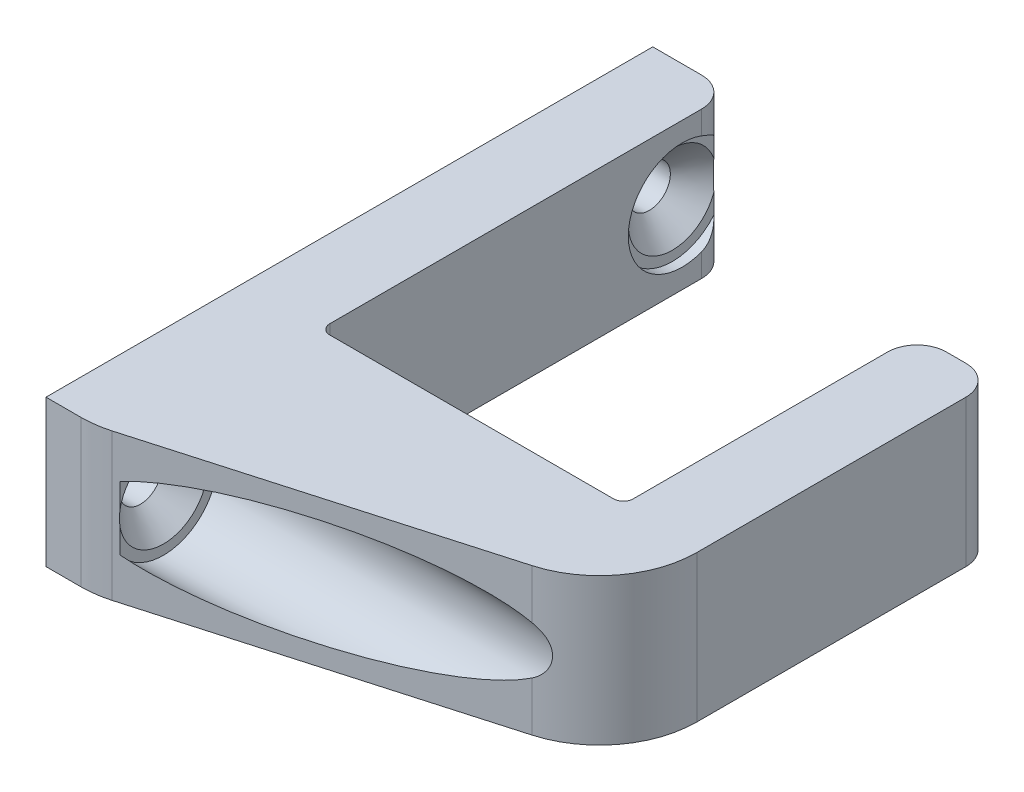
ISO-10303-21;
HEADER;
FILE_DESCRIPTION(('STEP AP214'),'2;1');
FILE_NAME('part.step','',(''),(''),'','','');
FILE_SCHEMA(('AUTOMOTIVE_DESIGN { 1 0 10303 214 1 1 1 1 }'));
ENDSEC;
DATA;
#1=APPLICATION_CONTEXT('core data for automotive mechanical design processes');
#2=APPLICATION_PROTOCOL_DEFINITION('international standard','automotive_design',2000,#1);
#3=PRODUCT_CONTEXT('',#1,'mechanical');
#4=PRODUCT('Part','Part','',(#3));
#5=PRODUCT_RELATED_PRODUCT_CATEGORY('part','',(#4));
#6=PRODUCT_DEFINITION_FORMATION('','',#4);
#7=PRODUCT_DEFINITION_CONTEXT('part definition',#1,'design');
#8=PRODUCT_DEFINITION('design','',#6,#7);
#9=PRODUCT_DEFINITION_SHAPE('','',#8);
#10=(LENGTH_UNIT() NAMED_UNIT(*) SI_UNIT(.MILLI.,.METRE.));
#11=(NAMED_UNIT(*) PLANE_ANGLE_UNIT() SI_UNIT($,.RADIAN.));
#12=(NAMED_UNIT(*) SI_UNIT($,.STERADIAN.) SOLID_ANGLE_UNIT());
#13=UNCERTAINTY_MEASURE_WITH_UNIT(LENGTH_MEASURE(1.E-05),#10,'distance_accuracy_value','');
#14=(GEOMETRIC_REPRESENTATION_CONTEXT(3) GLOBAL_UNCERTAINTY_ASSIGNED_CONTEXT((#13)) GLOBAL_UNIT_ASSIGNED_CONTEXT((#10,
#11,#12)) REPRESENTATION_CONTEXT('',''));
#15=CARTESIAN_POINT('',(0.,0.,0.));
#16=DIRECTION('',(0.,0.,1.));
#17=DIRECTION('',(1.,0.,0.));
#18=AXIS2_PLACEMENT_3D('',#15,#16,#17);
#19=CARTESIAN_POINT('',(31.,7.5,0.));
#20=DIRECTION('',(0.,0.,1.));
#21=DIRECTION('',(1.,0.,0.));
#22=AXIS2_PLACEMENT_3D('',#19,#20,#21);
#23=PLANE('',#22);
#24=DIRECTION('',(-1.,0.,0.));
#25=VECTOR('',#24,1.);
#26=CARTESIAN_POINT('',(31.,7.5,0.));
#27=LINE('',#26,#25);
#28=CARTESIAN_POINT('',(30.,7.5,0.));
#29=VERTEX_POINT('',#28);
#30=CARTESIAN_POINT('',(1.,7.5,0.));
#31=VERTEX_POINT('',#30);
#32=EDGE_CURVE('E388',#29,#31,#27,.T.);
#33=ORIENTED_EDGE('',*,*,#32,.F.);
#34=DIRECTION('',(0.,-1.,0.));
#35=VECTOR('',#34,1.);
#36=CARTESIAN_POINT('',(30.,-7.5,0.));
#37=LINE('',#36,#35);
#38=CARTESIAN_POINT('',(30.,-7.5,0.));
#39=VERTEX_POINT('',#38);
#40=EDGE_CURVE('E439',#29,#39,#37,.T.);
#41=ORIENTED_EDGE('',*,*,#40,.T.);
#42=DIRECTION('',(-1.,0.,0.));
#43=VECTOR('',#42,1.);
#44=CARTESIAN_POINT('',(31.,-7.5,0.));
#45=LINE('',#44,#43);
#46=CARTESIAN_POINT('',(1.,-7.5,0.));
#47=VERTEX_POINT('',#46);
#48=EDGE_CURVE('E412',#39,#47,#45,.T.);
#49=ORIENTED_EDGE('',*,*,#48,.T.);
#50=DIRECTION('',(0.,-1.,0.));
#51=VECTOR('',#50,1.);
#52=CARTESIAN_POINT('',(1.,7.5,0.));
#53=LINE('',#52,#51);
#54=EDGE_CURVE('E297',#47,#31,#53,.F.);
#55=ORIENTED_EDGE('',*,*,#54,.T.);
#56=EDGE_LOOP('',(#33,#41,#49,#55));
#57=FACE_BOUND('',#56,.T.);
#58=ADVANCED_FACE('F33',(#57),#23,.F.);
#59=CARTESIAN_POINT('',(0.,7.5,0.));
#60=DIRECTION('',(-1.,0.,0.));
#61=DIRECTION('',(0.,0.,1.));
#62=AXIS2_PLACEMENT_3D('',#59,#60,#61);
#63=PLANE('',#62);
#64=DIRECTION('',(0.,-1.,0.));
#65=VECTOR('',#64,1.);
#66=CARTESIAN_POINT('',(0.,7.5,-39.));
#67=LINE('',#66,#65);
#68=CARTESIAN_POINT('',(0.,-7.5,-39.));
#69=VERTEX_POINT('',#68);
#70=CARTESIAN_POINT('',(0.,-5.1234753829798,-39.));
#71=VERTEX_POINT('',#70);
#72=EDGE_CURVE('E245',#69,#71,#67,.F.);
#73=ORIENTED_EDGE('',*,*,#72,.T.);
#74=CARTESIAN_POINT('',(0.,0.,-37.));
#75=DIRECTION('',(-1.,0.,0.));
#76=DIRECTION('',(0.,0.,1.));
#77=AXIS2_PLACEMENT_3D('',#74,#75,#76);
#78=CIRCLE('',#77,5.5);
#79=CARTESIAN_POINT('',(0.,5.1234753829798,-39.));
#80=VERTEX_POINT('',#79);
#81=EDGE_CURVE('E362',#71,#80,#78,.T.);
#82=ORIENTED_EDGE('',*,*,#81,.T.);
#83=CARTESIAN_POINT('',(0.,7.5,-39.));
#84=VERTEX_POINT('',#83);
#85=EDGE_CURVE('E353',#80,#84,#67,.F.);
#86=ORIENTED_EDGE('',*,*,#85,.T.);
#87=DIRECTION('',(0.,0.,-1.));
#88=VECTOR('',#87,1.);
#89=CARTESIAN_POINT('',(0.,7.5,0.));
#90=LINE('',#89,#88);
#91=CARTESIAN_POINT('',(0.,7.5,-1.));
#92=VERTEX_POINT('',#91);
#93=EDGE_CURVE('E390',#92,#84,#90,.T.);
#94=ORIENTED_EDGE('',*,*,#93,.F.);
#95=DIRECTION('',(0.,-1.,0.));
#96=VECTOR('',#95,1.);
#97=CARTESIAN_POINT('',(0.,-7.5,-1.));
#98=LINE('',#97,#96);
#99=CARTESIAN_POINT('',(0.,-7.5,-1.));
#100=VERTEX_POINT('',#99);
#101=EDGE_CURVE('E299',#92,#100,#98,.T.);
#102=ORIENTED_EDGE('',*,*,#101,.T.);
#103=DIRECTION('',(0.,0.,-1.));
#104=VECTOR('',#103,1.);
#105=CARTESIAN_POINT('',(0.,-7.5,0.));
#106=LINE('',#105,#104);
#107=EDGE_CURVE('E364',#100,#69,#106,.T.);
#108=ORIENTED_EDGE('',*,*,#107,.T.);
#109=EDGE_LOOP('',(#73,#82,#86,#94,#102,#108));
#110=FACE_BOUND('',#109,.T.);
#111=ADVANCED_FACE('F270',(#110),#63,.F.);
#112=CARTESIAN_POINT('',(0.,7.5,-42.));
#113=DIRECTION('',(0.,0.,1.));
#114=DIRECTION('',(1.,0.,0.));
#115=AXIS2_PLACEMENT_3D('',#112,#113,#114);
#116=PLANE('',#115);
#117=DIRECTION('',(-1.,0.,0.));
#118=VECTOR('',#117,1.);
#119=CARTESIAN_POINT('',(0.,7.5,-42.));
#120=LINE('',#119,#118);
#121=CARTESIAN_POINT('',(-3.,7.5,-42.));
#122=VERTEX_POINT('',#121);
#123=CARTESIAN_POINT('',(-8.,7.5,-42.));
#124=VERTEX_POINT('',#123);
#125=EDGE_CURVE('E393',#122,#124,#120,.T.);
#126=ORIENTED_EDGE('',*,*,#125,.F.);
#127=DIRECTION('',(0.,-1.,0.));
#128=VECTOR('',#127,1.);
#129=CARTESIAN_POINT('',(-3.,7.5,-42.));
#130=LINE('',#129,#128);
#131=CARTESIAN_POINT('',(-3.,-7.5,-42.));
#132=VERTEX_POINT('',#131);
#133=EDGE_CURVE('E351',#122,#132,#130,.T.);
#134=ORIENTED_EDGE('',*,*,#133,.T.);
#135=DIRECTION('',(-1.,0.,0.));
#136=VECTOR('',#135,1.);
#137=CARTESIAN_POINT('',(0.,-7.5,-42.));
#138=LINE('',#137,#136);
#139=CARTESIAN_POINT('',(-8.,-7.5,-42.));
#140=VERTEX_POINT('',#139);
#141=EDGE_CURVE('E416',#132,#140,#138,.T.);
#142=ORIENTED_EDGE('',*,*,#141,.T.);
#143=DIRECTION('',(0.,-1.,0.));
#144=VECTOR('',#143,1.);
#145=CARTESIAN_POINT('',(-8.,7.5,-42.));
#146=LINE('',#145,#144);
#147=EDGE_CURVE('E435',#124,#140,#146,.T.);
#148=ORIENTED_EDGE('',*,*,#147,.F.);
#149=EDGE_LOOP('',(#126,#134,#142,#148));
#150=FACE_BOUND('',#149,.T.);
#151=ADVANCED_FACE('F276',(#150),#116,.F.);
#152=CARTESIAN_POINT('',(-8.,7.5,-42.));
#153=DIRECTION('',(1.,0.,0.));
#154=DIRECTION('',(0.,0.,-1.));
#155=AXIS2_PLACEMENT_3D('',#152,#153,#154);
#156=PLANE('',#155);
#157=CARTESIAN_POINT('',(-8.,0.,-37.));
#158=DIRECTION('',(1.,0.,0.));
#159=DIRECTION('',(0.,0.,-1.));
#160=AXIS2_PLACEMENT_3D('',#157,#158,#159);
#161=CIRCLE('',#160,2.15);
#162=CARTESIAN_POINT('',(-8.,0.,-39.15));
#163=VERTEX_POINT('',#162);
#164=EDGE_CURVE('E369',#163,#163,#161,.T.);
#165=ORIENTED_EDGE('',*,*,#164,.T.);
#166=EDGE_LOOP('',(#165));
#167=FACE_BOUND('',#166,.T.);
#168=CARTESIAN_POINT('',(-8.,0.,15.));
#169=DIRECTION('',(1.,0.,0.));
#170=DIRECTION('',(0.,0.,-1.));
#171=AXIS2_PLACEMENT_3D('',#168,#169,#170);
#172=CIRCLE('',#171,2.15);
#173=CARTESIAN_POINT('',(-8.,0.,12.85));
#174=VERTEX_POINT('',#173);
#175=EDGE_CURVE('E382',#174,#174,#172,.T.);
#176=ORIENTED_EDGE('',*,*,#175,.T.);
#177=EDGE_LOOP('',(#176));
#178=FACE_BOUND('',#177,.T.);
#179=DIRECTION('',(0.,0.,1.));
#180=VECTOR('',#179,1.);
#181=CARTESIAN_POINT('',(-8.,-7.5,-42.));
#182=LINE('',#181,#180);
#183=CARTESIAN_POINT('',(-7.99999999999999,-7.5,20.));
#184=VERTEX_POINT('',#183);
#185=EDGE_CURVE('E418',#140,#184,#182,.T.);
#186=ORIENTED_EDGE('',*,*,#185,.T.);
#187=DIRECTION('',(0.,-1.,0.));
#188=VECTOR('',#187,1.);
#189=CARTESIAN_POINT('',(-7.99999999999999,7.5,20.));
#190=LINE('',#189,#188);
#191=CARTESIAN_POINT('',(-7.99999999999999,7.5,20.));
#192=VERTEX_POINT('',#191);
#193=EDGE_CURVE('E411',#192,#184,#190,.T.);
#194=ORIENTED_EDGE('',*,*,#193,.F.);
#195=DIRECTION('',(0.,0.,1.));
#196=VECTOR('',#195,1.);
#197=CARTESIAN_POINT('',(-8.,7.5,-42.));
#198=LINE('',#197,#196);
#199=EDGE_CURVE('E395',#124,#192,#198,.T.);
#200=ORIENTED_EDGE('',*,*,#199,.F.);
#201=ORIENTED_EDGE('',*,*,#147,.T.);
#202=EDGE_LOOP('',(#186,#194,#200,#201));
#203=FACE_BOUND('',#202,.T.);
#204=ADVANCED_FACE('F463',(#167,#178,#203),#156,.F.);
#205=CARTESIAN_POINT('',(-7.99999999999999,7.5,20.));
#206=DIRECTION('',(0.,0.,-1.));
#207=DIRECTION('',(-1.,0.,0.));
#208=AXIS2_PLACEMENT_3D('',#205,#206,#207);
#209=PLANE('',#208);
#210=DIRECTION('',(1.,0.,0.));
#211=VECTOR('',#210,1.);
#212=CARTESIAN_POINT('',(-7.99999999999999,-7.5,20.));
#213=LINE('',#212,#211);
#214=CARTESIAN_POINT('',(-4.40054944640259,-7.5,20.));
#215=VERTEX_POINT('',#214);
#216=EDGE_CURVE('E420',#184,#215,#213,.T.);
#217=ORIENTED_EDGE('',*,*,#216,.T.);
#218=DIRECTION('',(0.,-1.,0.));
#219=VECTOR('',#218,1.);
#220=CARTESIAN_POINT('',(-4.40054944640259,7.5,20.));
#221=LINE('',#220,#219);
#222=CARTESIAN_POINT('',(-4.40054944640259,7.5,20.));
#223=VERTEX_POINT('',#222);
#224=EDGE_CURVE('E321',#215,#223,#221,.F.);
#225=ORIENTED_EDGE('',*,*,#224,.T.);
#226=DIRECTION('',(1.,0.,0.));
#227=VECTOR('',#226,1.);
#228=CARTESIAN_POINT('',(-7.99999999999999,7.5,20.));
#229=LINE('',#228,#227);
#230=EDGE_CURVE('E397',#192,#223,#229,.T.);
#231=ORIENTED_EDGE('',*,*,#230,.F.);
#232=ORIENTED_EDGE('',*,*,#193,.T.);
#233=EDGE_LOOP('',(#217,#225,#231,#232));
#234=FACE_BOUND('',#233,.T.);
#235=ADVANCED_FACE('F505',(#234),#209,.F.);
#236=CARTESIAN_POINT('',(-2.99999999999999,7.5,20.));
#237=DIRECTION('',(-0.274721127897378,0.,-0.961523947640823));
#238=DIRECTION('',(-0.961523947640823,0.,0.274721127897378));
#239=AXIS2_PLACEMENT_3D('',#236,#237,#238);
#240=PLANE('',#239);
#241=DIRECTION('',(0.,-1.,0.));
#242=VECTOR('',#241,1.);
#243=CARTESIAN_POINT('',(31.7472112789738,7.5,10.0722253488646));
#244=LINE('',#243,#242);
#245=CARTESIAN_POINT('',(31.7472112789738,-7.5,10.0722253488646));
#246=VERTEX_POINT('',#245);
#247=CARTESIAN_POINT('',(31.7472112789738,-2.44275192920356,10.0722253488646));
#248=VERTEX_POINT('',#247);
#249=EDGE_CURVE('E307',#246,#248,#244,.F.);
#250=ORIENTED_EDGE('',*,*,#249,.T.);
#251=CARTESIAN_POINT('',(14.5,0.,15.));
#252=DIRECTION('',(-0.274721127897378,0.,-0.961523947640823));
#253=DIRECTION('',(0.961523947640823,0.,-0.274721127897378));
#254=AXIS2_PLACEMENT_3D('',#251,#252,#253);
#255=ELLIPSE('',#254,20.0203021955214,5.5);
#256=CARTESIAN_POINT('',(-1.,-3.26155715909453,19.4285714285714));
#257=VERTEX_POINT('',#256);
#258=EDGE_CURVE('E60',#248,#257,#255,.T.);
#259=ORIENTED_EDGE('',*,*,#258,.T.);
#260=DIRECTION('',(0.,1.,0.));
#261=VECTOR('',#260,1.);
#262=CARTESIAN_POINT('',(-1.,7.5,19.4285714285714));
#263=LINE('',#262,#261);
#264=CARTESIAN_POINT('',(-1.,-0.798595706249905,19.4285714285714));
#265=VERTEX_POINT('',#264);
#266=EDGE_CURVE('E192',#257,#265,#263,.T.);
#267=ORIENTED_EDGE('',*,*,#266,.T.);
#268=CARTESIAN_POINT('',(-0.999799999999978,-0.800038287349248,19.4285142857143));
#269=CARTESIAN_POINT('',(-1.01827399540867,-0.667278613983204,19.4337925701168));
#270=CARTESIAN_POINT('',(-1.03223751921894,-0.533821122148111,19.4377821483483));
#271=CARTESIAN_POINT('',(-1.0508542556462,-0.266906677776435,19.4431012158989));
#272=CARTESIAN_POINT('',(-1.05555555555555,-0.133453338888257,19.4444444444444));
#273=CARTESIAN_POINT('',(-1.05555555555555,0.133453338888099,19.4444444444444));
#274=CARTESIAN_POINT('',(-1.05085425564621,0.266906677776278,19.4431012158989));
#275=CARTESIAN_POINT('',(-1.03223751921896,0.533821122147954,19.4377821483483));
#276=CARTESIAN_POINT('',(-1.01827399540868,0.667278613983047,19.4337925701168));
#277=CARTESIAN_POINT('',(-0.9998,0.800038287349092,19.4285142857143));
#278=B_SPLINE_CURVE_WITH_KNOTS('',3,(#268,#269,#270,#271,#272,#273,#274,#275,#276,#277),
.UNSPECIFIED.,.F.,.F.,(4,2,2,2,4),(0.,0.402374578373964,0.802654558989266,1.20293453960457,
1.60530911797853),.UNSPECIFIED.);
#279=CARTESIAN_POINT('',(-1.,0.798595706249905,19.4285714285714));
#280=VERTEX_POINT('',#279);
#281=EDGE_CURVE('E244',#265,#280,#278,.T.);
#282=ORIENTED_EDGE('',*,*,#281,.T.);
#283=CARTESIAN_POINT('',(-1.,3.26155715909453,19.4285714285714));
#284=VERTEX_POINT('',#283);
#285=EDGE_CURVE('E675',#280,#284,#263,.T.);
#286=ORIENTED_EDGE('',*,*,#285,.T.);
#287=CARTESIAN_POINT('',(31.7472112789738,2.44275192920357,10.0722253488646));
#288=VERTEX_POINT('',#287);
#289=EDGE_CURVE('E385',#284,#288,#255,.T.);
#290=ORIENTED_EDGE('',*,*,#289,.T.);
#291=CARTESIAN_POINT('',(31.7472112789738,7.5,10.0722253488646));
#292=VERTEX_POINT('',#291);
#293=EDGE_CURVE('E304',#288,#292,#244,.F.);
#294=ORIENTED_EDGE('',*,*,#293,.T.);
#295=DIRECTION('',(0.961523947640823,0.,-0.274721127897378));
#296=VECTOR('',#295,1.);
#297=CARTESIAN_POINT('',(-2.99999999999999,7.5,20.));
#298=LINE('',#297,#296);
#299=CARTESIAN_POINT('',(-1.6533381674288,7.5,19.6152394764082));
#300=VERTEX_POINT('',#299);
#301=EDGE_CURVE('E400',#300,#292,#298,.T.);
#302=ORIENTED_EDGE('',*,*,#301,.F.);
#303=DIRECTION('',(0.,-1.,0.));
#304=VECTOR('',#303,1.);
#305=CARTESIAN_POINT('',(-1.6533381674288,7.5,19.6152394764082));
#306=LINE('',#305,#304);
#307=CARTESIAN_POINT('',(-1.6533381674288,-7.5,19.6152394764082));
#308=VERTEX_POINT('',#307);
#309=EDGE_CURVE('E314',#300,#308,#306,.T.);
#310=ORIENTED_EDGE('',*,*,#309,.T.);
#311=DIRECTION('',(0.961523947640823,0.,-0.274721127897378));
#312=VECTOR('',#311,1.);
#313=CARTESIAN_POINT('',(-2.99999999999999,-7.5,20.));
#314=LINE('',#313,#312);
#315=EDGE_CURVE('E423',#308,#246,#314,.T.);
#316=ORIENTED_EDGE('',*,*,#315,.T.);
#317=EDGE_LOOP('',(#250,#259,#267,#282,#286,#290,#294,#302,#310,#316));
#318=FACE_BOUND('',#317,.T.);
#319=ADVANCED_FACE('F472',(#318),#240,.F.);
#320=CARTESIAN_POINT('',(39.,7.5,8.));
#321=DIRECTION('',(-1.,0.,0.));
#322=DIRECTION('',(0.,0.,1.));
#323=AXIS2_PLACEMENT_3D('',#320,#321,#322);
#324=PLANE('',#323);
#325=DIRECTION('',(0.,0.,-1.));
#326=VECTOR('',#325,1.);
#327=CARTESIAN_POINT('',(39.,-7.5,8.));
#328=LINE('',#327,#326);
#329=CARTESIAN_POINT('',(39.,-7.5,0.456985872456401));
#330=VERTEX_POINT('',#329);
#331=CARTESIAN_POINT('',(39.,-7.5,-27.));
#332=VERTEX_POINT('',#331);
#333=EDGE_CURVE('E426',#330,#332,#328,.T.);
#334=ORIENTED_EDGE('',*,*,#333,.T.);
#335=DIRECTION('',(0.,-1.,0.));
#336=VECTOR('',#335,1.);
#337=CARTESIAN_POINT('',(39.,7.5,-27.));
#338=LINE('',#337,#336);
#339=CARTESIAN_POINT('',(39.,7.5,-27.));
#340=VERTEX_POINT('',#339);
#341=EDGE_CURVE('E341',#332,#340,#338,.F.);
#342=ORIENTED_EDGE('',*,*,#341,.T.);
#343=DIRECTION('',(0.,0.,-1.));
#344=VECTOR('',#343,1.);
#345=CARTESIAN_POINT('',(39.,7.5,8.));
#346=LINE('',#345,#344);
#347=CARTESIAN_POINT('',(39.,7.5,0.456985872456401));
#348=VERTEX_POINT('',#347);
#349=EDGE_CURVE('E403',#348,#340,#346,.T.);
#350=ORIENTED_EDGE('',*,*,#349,.F.);
#351=DIRECTION('',(0.,-1.,0.));
#352=VECTOR('',#351,1.);
#353=CARTESIAN_POINT('',(39.,7.5,0.456985872456401));
#354=LINE('',#353,#352);
#355=EDGE_CURVE('E327',#348,#330,#354,.T.);
#356=ORIENTED_EDGE('',*,*,#355,.T.);
#357=EDGE_LOOP('',(#334,#342,#350,#356));
#358=FACE_BOUND('',#357,.T.);
#359=ADVANCED_FACE('F480',(#358),#324,.F.);
#360=CARTESIAN_POINT('',(39.,7.5,-30.));
#361=DIRECTION('',(0.,0.,1.));
#362=DIRECTION('',(1.,0.,0.));
#363=AXIS2_PLACEMENT_3D('',#360,#361,#362);
#364=PLANE('',#363);
#365=DIRECTION('',(-1.,0.,0.));
#366=VECTOR('',#365,1.);
#367=CARTESIAN_POINT('',(39.,7.5,-30.));
#368=LINE('',#367,#366);
#369=CARTESIAN_POINT('',(36.,7.5,-30.));
#370=VERTEX_POINT('',#369);
#371=CARTESIAN_POINT('',(34.,7.5,-30.));
#372=VERTEX_POINT('',#371);
#373=EDGE_CURVE('E406',#370,#372,#368,.T.);
#374=ORIENTED_EDGE('',*,*,#373,.F.);
#375=DIRECTION('',(0.,-1.,0.));
#376=VECTOR('',#375,1.);
#377=CARTESIAN_POINT('',(36.,7.5,-30.));
#378=LINE('',#377,#376);
#379=CARTESIAN_POINT('',(36.,-7.5,-30.));
#380=VERTEX_POINT('',#379);
#381=EDGE_CURVE('E332',#370,#380,#378,.T.);
#382=ORIENTED_EDGE('',*,*,#381,.T.);
#383=DIRECTION('',(-1.,0.,0.));
#384=VECTOR('',#383,1.);
#385=CARTESIAN_POINT('',(39.,-7.5,-30.));
#386=LINE('',#385,#384);
#387=CARTESIAN_POINT('',(34.,-7.5,-30.));
#388=VERTEX_POINT('',#387);
#389=EDGE_CURVE('E429',#380,#388,#386,.T.);
#390=ORIENTED_EDGE('',*,*,#389,.T.);
#391=DIRECTION('',(0.,-1.,0.));
#392=VECTOR('',#391,1.);
#393=CARTESIAN_POINT('',(34.,7.5,-30.));
#394=LINE('',#393,#392);
#395=EDGE_CURVE('E330',#388,#372,#394,.F.);
#396=ORIENTED_EDGE('',*,*,#395,.T.);
#397=EDGE_LOOP('',(#374,#382,#390,#396));
#398=FACE_BOUND('',#397,.T.);
#399=ADVANCED_FACE('F486',(#398),#364,.F.);
#400=CARTESIAN_POINT('',(31.,7.5,-30.));
#401=DIRECTION('',(1.,0.,0.));
#402=DIRECTION('',(0.,0.,-1.));
#403=AXIS2_PLACEMENT_3D('',#400,#401,#402);
#404=PLANE('',#403);
#405=DIRECTION('',(0.,0.,1.));
#406=VECTOR('',#405,1.);
#407=CARTESIAN_POINT('',(31.,7.5,-30.));
#408=LINE('',#407,#406);
#409=CARTESIAN_POINT('',(31.,7.5,-27.));
#410=VERTEX_POINT('',#409);
#411=CARTESIAN_POINT('',(31.,7.5,-1.));
#412=VERTEX_POINT('',#411);
#413=EDGE_CURVE('E409',#410,#412,#408,.T.);
#414=ORIENTED_EDGE('',*,*,#413,.F.);
#415=DIRECTION('',(0.,-1.,0.));
#416=VECTOR('',#415,1.);
#417=CARTESIAN_POINT('',(31.,7.5,-27.));
#418=LINE('',#417,#416);
#419=CARTESIAN_POINT('',(31.,-7.5,-27.));
#420=VERTEX_POINT('',#419);
#421=EDGE_CURVE('E349',#410,#420,#418,.T.);
#422=ORIENTED_EDGE('',*,*,#421,.T.);
#423=DIRECTION('',(0.,0.,1.));
#424=VECTOR('',#423,1.);
#425=CARTESIAN_POINT('',(31.,-7.5,-30.));
#426=LINE('',#425,#424);
#427=CARTESIAN_POINT('',(31.,-7.5,-1.));
#428=VERTEX_POINT('',#427);
#429=EDGE_CURVE('E391',#420,#428,#426,.T.);
#430=ORIENTED_EDGE('',*,*,#429,.T.);
#431=DIRECTION('',(0.,-1.,0.));
#432=VECTOR('',#431,1.);
#433=CARTESIAN_POINT('',(31.,7.5,-1.));
#434=LINE('',#433,#432);
#435=EDGE_CURVE('E442',#428,#412,#434,.F.);
#436=ORIENTED_EDGE('',*,*,#435,.T.);
#437=EDGE_LOOP('',(#414,#422,#430,#436));
#438=FACE_BOUND('',#437,.T.);
#439=ADVANCED_FACE('F490',(#438),#404,.F.);
#440=CARTESIAN_POINT('',(0.,7.5,0.));
#441=DIRECTION('',(0.,-1.,0.));
#442=DIRECTION('',(0.,0.,-1.));
#443=AXIS2_PLACEMENT_3D('',#440,#441,#442);
#444=PLANE('',#443);
#445=ORIENTED_EDGE('',*,*,#349,.T.);
#446=CARTESIAN_POINT('',(36.,7.5,-27.));
#447=DIRECTION('',(0.,-1.,0.));
#448=DIRECTION('',(0.,0.,-1.));
#449=AXIS2_PLACEMENT_3D('',#446,#447,#448);
#450=CIRCLE('',#449,3.);
#451=EDGE_CURVE('E347',#340,#370,#450,.F.);
#452=ORIENTED_EDGE('',*,*,#451,.T.);
#453=ORIENTED_EDGE('',*,*,#373,.T.);
#454=CARTESIAN_POINT('',(34.,7.5,-27.));
#455=DIRECTION('',(0.,-1.,0.));
#456=DIRECTION('',(0.,0.,-1.));
#457=AXIS2_PLACEMENT_3D('',#454,#455,#456);
#458=CIRCLE('',#457,3.);
#459=EDGE_CURVE('E345',#372,#410,#458,.F.);
#460=ORIENTED_EDGE('',*,*,#459,.T.);
#461=ORIENTED_EDGE('',*,*,#413,.T.);
#462=CARTESIAN_POINT('',(30.,7.5,-1.));
#463=DIRECTION('',(0.,-1.,0.));
#464=DIRECTION('',(0.,0.,-1.));
#465=AXIS2_PLACEMENT_3D('',#462,#463,#464);
#466=CIRCLE('',#465,1.);
#467=EDGE_CURVE('E309',#412,#29,#466,.T.);
#468=ORIENTED_EDGE('',*,*,#467,.T.);
#469=ORIENTED_EDGE('',*,*,#32,.T.);
#470=CARTESIAN_POINT('',(1.,7.5,-1.));
#471=DIRECTION('',(0.,-1.,0.));
#472=DIRECTION('',(0.,0.,-1.));
#473=AXIS2_PLACEMENT_3D('',#470,#471,#472);
#474=CIRCLE('',#473,1.);
#475=EDGE_CURVE('E296',#31,#92,#474,.T.);
#476=ORIENTED_EDGE('',*,*,#475,.T.);
#477=ORIENTED_EDGE('',*,*,#93,.T.);
#478=CARTESIAN_POINT('',(-3.,7.5,-39.));
#479=DIRECTION('',(0.,-1.,0.));
#480=DIRECTION('',(0.,0.,-1.));
#481=AXIS2_PLACEMENT_3D('',#478,#479,#480);
#482=CIRCLE('',#481,3.);
#483=EDGE_CURVE('E343',#84,#122,#482,.F.);
#484=ORIENTED_EDGE('',*,*,#483,.T.);
#485=ORIENTED_EDGE('',*,*,#125,.T.);
#486=ORIENTED_EDGE('',*,*,#199,.T.);
#487=ORIENTED_EDGE('',*,*,#230,.T.);
#488=CARTESIAN_POINT('',(-4.40054944640259,7.5,10.));
#489=DIRECTION('',(0.,-1.,0.));
#490=DIRECTION('',(0.,0.,-1.));
#491=AXIS2_PLACEMENT_3D('',#488,#489,#490);
#492=CIRCLE('',#491,10.);
#493=EDGE_CURVE('E325',#223,#300,#492,.F.);
#494=ORIENTED_EDGE('',*,*,#493,.T.);
#495=ORIENTED_EDGE('',*,*,#301,.T.);
#496=CARTESIAN_POINT('',(29.,7.5,0.456985872456401));
#497=DIRECTION('',(0.,-1.,0.));
#498=DIRECTION('',(0.,0.,-1.));
#499=AXIS2_PLACEMENT_3D('',#496,#497,#498);
#500=CIRCLE('',#499,10.);
#501=EDGE_CURVE('E323',#292,#348,#500,.F.);
#502=ORIENTED_EDGE('',*,*,#501,.T.);
#503=EDGE_LOOP('',(#445,#452,#453,#460,#461,#468,#469,#476,#477,#484,#485,#486,#487,#494,#495,#502));
#504=FACE_BOUND('',#503,.T.);
#505=ADVANCED_FACE('F449',(#504),#444,.F.);
#506=CARTESIAN_POINT('',(0.,-7.5,0.));
#507=DIRECTION('',(0.,-1.,0.));
#508=DIRECTION('',(0.,0.,-1.));
#509=AXIS2_PLACEMENT_3D('',#506,#507,#508);
#510=PLANE('',#509);
#511=ORIENTED_EDGE('',*,*,#389,.F.);
#512=CARTESIAN_POINT('',(36.,-7.5,-27.));
#513=DIRECTION('',(0.,-1.,0.));
#514=DIRECTION('',(0.,0.,-1.));
#515=AXIS2_PLACEMENT_3D('',#512,#513,#514);
#516=CIRCLE('',#515,3.);
#517=EDGE_CURVE('E339',#380,#332,#516,.T.);
#518=ORIENTED_EDGE('',*,*,#517,.T.);
#519=ORIENTED_EDGE('',*,*,#333,.F.);
#520=CARTESIAN_POINT('',(29.,-7.5,0.456985872456401));
#521=DIRECTION('',(0.,-1.,0.));
#522=DIRECTION('',(0.,0.,-1.));
#523=AXIS2_PLACEMENT_3D('',#520,#521,#522);
#524=CIRCLE('',#523,10.);
#525=EDGE_CURVE('E317',#330,#246,#524,.T.);
#526=ORIENTED_EDGE('',*,*,#525,.T.);
#527=ORIENTED_EDGE('',*,*,#315,.F.);
#528=CARTESIAN_POINT('',(-4.40054944640259,-7.5,10.));
#529=DIRECTION('',(0.,-1.,0.));
#530=DIRECTION('',(0.,0.,-1.));
#531=AXIS2_PLACEMENT_3D('',#528,#529,#530);
#532=CIRCLE('',#531,10.);
#533=EDGE_CURVE('E319',#308,#215,#532,.T.);
#534=ORIENTED_EDGE('',*,*,#533,.T.);
#535=ORIENTED_EDGE('',*,*,#216,.F.);
#536=ORIENTED_EDGE('',*,*,#185,.F.);
#537=ORIENTED_EDGE('',*,*,#141,.F.);
#538=CARTESIAN_POINT('',(-3.,-7.5,-39.));
#539=DIRECTION('',(0.,-1.,0.));
#540=DIRECTION('',(0.,0.,-1.));
#541=AXIS2_PLACEMENT_3D('',#538,#539,#540);
#542=CIRCLE('',#541,3.);
#543=EDGE_CURVE('E335',#132,#69,#542,.T.);
#544=ORIENTED_EDGE('',*,*,#543,.T.);
#545=ORIENTED_EDGE('',*,*,#107,.F.);
#546=CARTESIAN_POINT('',(1.,-7.5,-1.));
#547=DIRECTION('',(0.,-1.,0.));
#548=DIRECTION('',(0.,0.,-1.));
#549=AXIS2_PLACEMENT_3D('',#546,#547,#548);
#550=CIRCLE('',#549,1.);
#551=EDGE_CURVE('E305',#100,#47,#550,.F.);
#552=ORIENTED_EDGE('',*,*,#551,.T.);
#553=ORIENTED_EDGE('',*,*,#48,.F.);
#554=CARTESIAN_POINT('',(30.,-7.5,-1.));
#555=DIRECTION('',(0.,-1.,0.));
#556=DIRECTION('',(0.,0.,-1.));
#557=AXIS2_PLACEMENT_3D('',#554,#555,#556);
#558=CIRCLE('',#557,1.);
#559=EDGE_CURVE('E446',#39,#428,#558,.F.);
#560=ORIENTED_EDGE('',*,*,#559,.T.);
#561=ORIENTED_EDGE('',*,*,#429,.F.);
#562=CARTESIAN_POINT('',(34.,-7.5,-27.));
#563=DIRECTION('',(0.,-1.,0.));
#564=DIRECTION('',(0.,0.,-1.));
#565=AXIS2_PLACEMENT_3D('',#562,#563,#564);
#566=CIRCLE('',#565,3.);
#567=EDGE_CURVE('E337',#420,#388,#566,.T.);
#568=ORIENTED_EDGE('',*,*,#567,.T.);
#569=EDGE_LOOP('',(#511,#518,#519,#526,#527,#534,#535,#536,#537,#544,#545,#552,#553,#560,#561,#568));
#570=FACE_BOUND('',#569,.T.);
#571=ADVANCED_FACE('F285',(#570),#510,.T.);
#572=CARTESIAN_POINT('',(30.,7.5,-1.));
#573=DIRECTION('',(0.,1.,0.));
#574=DIRECTION('',(0.,0.,1.));
#575=AXIS2_PLACEMENT_3D('',#572,#573,#574);
#576=CYLINDRICAL_SURFACE('',#575,1.);
#577=ORIENTED_EDGE('',*,*,#467,.F.);
#578=ORIENTED_EDGE('',*,*,#435,.F.);
#579=ORIENTED_EDGE('',*,*,#559,.F.);
#580=ORIENTED_EDGE('',*,*,#40,.F.);
#581=EDGE_LOOP('',(#577,#578,#579,#580));
#582=FACE_BOUND('',#581,.T.);
#583=ADVANCED_FACE('F282',(#582),#576,.F.);
#584=CARTESIAN_POINT('',(1.,7.5,-1.));
#585=DIRECTION('',(0.,1.,0.));
#586=DIRECTION('',(0.,0.,1.));
#587=AXIS2_PLACEMENT_3D('',#584,#585,#586);
#588=CYLINDRICAL_SURFACE('',#587,1.);
#589=ORIENTED_EDGE('',*,*,#475,.F.);
#590=ORIENTED_EDGE('',*,*,#54,.F.);
#591=ORIENTED_EDGE('',*,*,#551,.F.);
#592=ORIENTED_EDGE('',*,*,#101,.F.);
#593=EDGE_LOOP('',(#589,#590,#591,#592));
#594=FACE_BOUND('',#593,.T.);
#595=ADVANCED_FACE('F284',(#594),#588,.F.);
#596=CARTESIAN_POINT('',(-4.40054944640259,7.5,10.));
#597=DIRECTION('',(0.,-1.,0.));
#598=DIRECTION('',(0.,0.,-1.));
#599=AXIS2_PLACEMENT_3D('',#596,#597,#598);
#600=CYLINDRICAL_SURFACE('',#599,10.);
#601=ORIENTED_EDGE('',*,*,#493,.F.);
#602=ORIENTED_EDGE('',*,*,#224,.F.);
#603=ORIENTED_EDGE('',*,*,#533,.F.);
#604=ORIENTED_EDGE('',*,*,#309,.F.);
#605=EDGE_LOOP('',(#601,#602,#603,#604));
#606=FACE_BOUND('',#605,.T.);
#607=ADVANCED_FACE('F257',(#606),#600,.T.);
#608=CARTESIAN_POINT('',(29.,7.5,0.456985872456401));
#609=DIRECTION('',(0.,-1.,0.));
#610=DIRECTION('',(0.,0.,-1.));
#611=AXIS2_PLACEMENT_3D('',#608,#609,#610);
#612=CYLINDRICAL_SURFACE('',#611,10.);
#613=CARTESIAN_POINT('',(31.7472112789738,-2.44275192920357,10.0722253488646));
#614=CARTESIAN_POINT('',(31.8157110957122,-2.40326486500099,10.0526571385304));
#615=CARTESIAN_POINT('',(31.8829050082357,-2.36175000429283,10.0326630939499));
#616=CARTESIAN_POINT('',(32.0143652767018,-2.27447412239246,9.99209626368795));
#617=CARTESIAN_POINT('',(32.0786294479784,-2.22871000738485,9.9715230640482));
#618=CARTESIAN_POINT('',(32.2672193322062,-2.08422459939167,9.90911949858535));
#619=CARTESIAN_POINT('',(32.3864403062921,-1.97882007030738,9.86686754679712));
#620=CARTESIAN_POINT('',(32.6077172322845,-1.74961864861205,9.78428010288835));
#621=CARTESIAN_POINT('',(32.7096968051167,-1.62574426691135,9.74395367855049));
#622=CARTESIAN_POINT('',(32.891335985416,-1.36111025951577,9.66932346835683));
#623=CARTESIAN_POINT('',(32.9710519221082,-1.22039455810755,9.63500456659993));
#624=CARTESIAN_POINT('',(33.070455998143,-0.999880914108855,9.59113514976418));
#625=CARTESIAN_POINT('',(33.1001290221001,-0.925203924674052,9.57782858235466));
#626=CARTESIAN_POINT('',(33.1526060447961,-0.773053032117751,9.55405643273588));
#627=CARTESIAN_POINT('',(33.1754137808761,-0.695580676562848,9.54358930509359));
#628=CARTESIAN_POINT('',(33.2137964990509,-0.538490767994644,9.52585409109295));
#629=CARTESIAN_POINT('',(33.2293706889575,-0.458872981032283,9.51858635512329));
#630=CARTESIAN_POINT('',(33.2530279939047,-0.298326299317225,9.50750598877375));
#631=CARTESIAN_POINT('',(33.2611124020438,-0.217397633341405,9.50369276198111));
#632=CARTESIAN_POINT('',(33.2725723852401,0.00111984550311392,9.49829398219682));
#633=CARTESIAN_POINT('',(33.2688421364283,0.139247158632833,9.5000646565125));
#634=CARTESIAN_POINT('',(33.2396525307549,0.41253456270812,9.51378329180353));
#635=CARTESIAN_POINT('',(33.2142006294844,0.547695655433694,9.52572776079267));
#636=CARTESIAN_POINT('',(33.1439753554156,0.807123918534153,9.55802376518702));
#637=CARTESIAN_POINT('',(33.099840581055,0.931600663139913,9.57809656107591));
#638=CARTESIAN_POINT('',(32.9942343033248,1.17155279933708,9.62483228424677));
#639=CARTESIAN_POINT('',(32.9327629255823,1.28702825614721,9.65149516377453));
#640=CARTESIAN_POINT('',(32.7885174458256,1.51709657746453,9.71191749654136));
#641=CARTESIAN_POINT('',(32.7043295542639,1.63068630599585,9.74609842580678));
#642=CARTESIAN_POINT('',(32.5208922403704,1.84416334011404,9.81716740850339));
#643=CARTESIAN_POINT('',(32.4216221375887,1.9440314672331,9.85405914251443));
#644=CARTESIAN_POINT('',(32.2286838342116,2.11415027862082,9.92187935232305));
#645=CARTESIAN_POINT('',(32.1368745099098,2.18655827083327,9.95276884114852));
#646=CARTESIAN_POINT('',(31.9466856685255,2.32169880790541,10.0135070847506));
#647=CARTESIAN_POINT('',(31.8483360295803,2.38447153071262,10.0433597360299));
#648=CARTESIAN_POINT('',(31.7472112789738,2.44275192920357,10.0722253488646));
#649=B_SPLINE_CURVE_WITH_KNOTS('',3,(#613,#614,#615,#616,#617,#618,#619,#620,#621,#622,#623,
#624,#625,#626,#627,#628,#629,#630,#631,#632,#633,#634,#635,#636,#637,#638,#639,#640,#641,#642,
#643,#644,#645,#646,#647,#648),.UNSPECIFIED.,.F.,.F.,(4,2,2,2,2,2,2,2,2,2,2,2,2,2,2,2,2,4),(0.,
0.244281764946833,0.488742803524062,0.980846987663041,1.47507709511422,1.96804518287462,
2.21207410208049,2.45596993500424,2.69989247209789,2.94377288851833,3.356049777152,
3.76818521558138,4.1672454990551,4.56630289087309,5.00106030168188,5.43641931558029,
5.79866631354259,6.15935915656533),.UNSPECIFIED.);
#650=EDGE_CURVE('E237',#248,#288,#649,.T.);
#651=ORIENTED_EDGE('',*,*,#650,.F.);
#652=ORIENTED_EDGE('',*,*,#249,.F.);
#653=ORIENTED_EDGE('',*,*,#525,.F.);
#654=ORIENTED_EDGE('',*,*,#355,.F.);
#655=ORIENTED_EDGE('',*,*,#501,.F.);
#656=ORIENTED_EDGE('',*,*,#293,.F.);
#657=EDGE_LOOP('',(#651,#652,#653,#654,#655,#656));
#658=FACE_BOUND('',#657,.T.);
#659=ADVANCED_FACE('F251',(#658),#612,.T.);
#660=CARTESIAN_POINT('',(36.,7.5,-27.));
#661=DIRECTION('',(0.,-1.,0.));
#662=DIRECTION('',(0.,0.,-1.));
#663=AXIS2_PLACEMENT_3D('',#660,#661,#662);
#664=CYLINDRICAL_SURFACE('',#663,3.);
#665=ORIENTED_EDGE('',*,*,#451,.F.);
#666=ORIENTED_EDGE('',*,*,#341,.F.);
#667=ORIENTED_EDGE('',*,*,#517,.F.);
#668=ORIENTED_EDGE('',*,*,#381,.F.);
#669=EDGE_LOOP('',(#665,#666,#667,#668));
#670=FACE_BOUND('',#669,.T.);
#671=ADVANCED_FACE('F256',(#670),#664,.T.);
#672=CARTESIAN_POINT('',(34.,7.5,-27.));
#673=DIRECTION('',(0.,-1.,0.));
#674=DIRECTION('',(0.,0.,-1.));
#675=AXIS2_PLACEMENT_3D('',#672,#673,#674);
#676=CYLINDRICAL_SURFACE('',#675,3.);
#677=ORIENTED_EDGE('',*,*,#459,.F.);
#678=ORIENTED_EDGE('',*,*,#395,.F.);
#679=ORIENTED_EDGE('',*,*,#567,.F.);
#680=ORIENTED_EDGE('',*,*,#421,.F.);
#681=EDGE_LOOP('',(#677,#678,#679,#680));
#682=FACE_BOUND('',#681,.T.);
#683=ADVANCED_FACE('F261',(#682),#676,.T.);
#684=CARTESIAN_POINT('',(-3.,7.5,-39.));
#685=DIRECTION('',(0.,-1.,0.));
#686=DIRECTION('',(0.,0.,-1.));
#687=AXIS2_PLACEMENT_3D('',#684,#685,#686);
#688=CYLINDRICAL_SURFACE('',#687,3.);
#689=CARTESIAN_POINT('',(0.,-5.1234753829798,-39.));
#690=CARTESIAN_POINT('',(1.00765691398758E-05,-5.08869020365795,-39.0891684343622));
#691=CARTESIAN_POINT('',(-0.00397394256231489,-5.05155794329443,-39.1773654692939));
#692=CARTESIAN_POINT('',(-0.0193409447721106,-4.9730791440006,-39.3510615713705));
#693=CARTESIAN_POINT('',(-0.0307135402089265,-4.93173859024266,-39.436564249843));
#694=CARTESIAN_POINT('',(-0.0601630906093876,-4.84554098429717,-39.6037536277756));
#695=CARTESIAN_POINT('',(-0.0781901636611063,-4.80071200598745,-39.6854637520723));
#696=CARTESIAN_POINT('',(-0.120378101232174,-4.70771071058815,-39.8453497001233));
#697=CARTESIAN_POINT('',(-0.144541552298552,-4.65953698989205,-39.9235240170875));
#698=CARTESIAN_POINT('',(-0.204343634091475,-4.54944111864327,-40.0927138414041));
#699=CARTESIAN_POINT('',(-0.24133630630772,-4.4868175401884,-40.1827951093258));
#700=CARTESIAN_POINT('',(-0.322692389652437,-4.35806593482382,-40.3569324322391));
#701=CARTESIAN_POINT('',(-0.367058144042065,-4.29193679836712,-40.4409865595314));
#702=CARTESIAN_POINT('',(-0.462501434333506,-4.15677036433642,-40.6031136210043));
#703=CARTESIAN_POINT('',(-0.513595693570478,-4.08772612188544,-40.6811708585637));
#704=CARTESIAN_POINT('',(-0.621773473933687,-3.94764819345814,-40.8310032352774));
#705=CARTESIAN_POINT('',(-0.678854090816116,-3.87661548432366,-40.9027813899725));
#706=CARTESIAN_POINT('',(-0.779790608470368,-3.75577221022649,-41.0185586418856));
#707=CARTESIAN_POINT('',(-0.822175012450677,-3.70629743994127,-41.0642062770822));
#708=CARTESIAN_POINT('',(-0.909303354344472,-3.60721536429172,-41.1523946324801));
#709=CARTESIAN_POINT('',(-0.954036123109476,-3.55760959298537,-41.1949481063265));
#710=CARTESIAN_POINT('',(-1.,-3.50795212196531,-41.2360679774998));
#711=B_SPLINE_CURVE_WITH_KNOTS('',3,(#689,#690,#691,#692,#693,#694,#695,#696,#697,#698,#699,
#700,#701,#702,#703,#704,#705,#706,#707,#708,#709,#710),.UNSPECIFIED.,.F.,.F.,(4,2,2,2,2,2,2,2,
2,2,4),(0.,0.2869477134283,0.573492875888718,0.857932327835422,1.14249187354252,
1.48933193252178,1.83628243331376,2.1841121366388,2.5317738664078,2.77032920433745,
3.00783781199274),.UNSPECIFIED.);
#712=CARTESIAN_POINT('',(-1.,-3.5079521219653,-41.2360679774998));
#713=VERTEX_POINT('',#712);
#714=EDGE_CURVE('E11',#71,#713,#711,.T.);
#715=ORIENTED_EDGE('',*,*,#714,.F.);
#716=ORIENTED_EDGE('',*,*,#72,.F.);
#717=ORIENTED_EDGE('',*,*,#543,.F.);
#718=ORIENTED_EDGE('',*,*,#133,.F.);
#719=ORIENTED_EDGE('',*,*,#483,.F.);
#720=ORIENTED_EDGE('',*,*,#85,.F.);
#721=CARTESIAN_POINT('',(-1.,3.50795212196531,-41.2360679774998));
#722=CARTESIAN_POINT('',(-0.926676587259814,3.58722315947826,-41.1704365986013));
#723=CARTESIAN_POINT('',(-0.856419983838908,3.66634986760933,-41.1011456070801));
#724=CARTESIAN_POINT('',(-0.72236271408043,3.82347548775383,-40.9550641767072));
#725=CARTESIAN_POINT('',(-0.658573221900569,3.9014722546674,-40.878261193361));
#726=CARTESIAN_POINT('',(-0.537315056329353,4.05612789264814,-40.7162500879252));
#727=CARTESIAN_POINT('',(-0.479929642984041,4.13276020058043,-40.6309536542679));
#728=CARTESIAN_POINT('',(-0.373224702565338,4.28266706592755,-40.4528718586213));
#729=CARTESIAN_POINT('',(-0.323899072033042,4.35594413362315,-40.3600922437213));
#730=CARTESIAN_POINT('',(-0.212695202683932,4.5324758306465,-40.1205893517738));
#731=CARTESIAN_POINT('',(-0.156171417683597,4.63321915656233,-39.9693647694899));
#732=CARTESIAN_POINT('',(-0.0895854904473056,4.77422756025828,-39.7322511612536));
#733=CARTESIAN_POINT('',(-0.0704499933677172,4.81944065249487,-39.6517246407531));
#734=CARTESIAN_POINT('',(-0.0386948804395124,4.90621619846237,-39.4874969780625));
#735=CARTESIAN_POINT('',(-0.0260712017574201,4.94778091500869,-39.4037978503985));
#736=CARTESIAN_POINT('',(-0.0114066112093024,5.01157726673231,-39.2665861645387));
#737=CARTESIAN_POINT('',(-0.00716173853586301,5.03508015973359,-39.2138879311554));
#738=CARTESIAN_POINT('',(-0.00145606723752079,5.08049914416492,-39.1075765620455));
#739=CARTESIAN_POINT('',(8.05318492678155E-07,5.10241295615785,-39.0539622432457));
#740=CARTESIAN_POINT('',(0.,5.1234753829798,-39.));
#741=B_SPLINE_CURVE_WITH_KNOTS('',3,(#721,#722,#723,#724,#725,#726,#727,#728,#729,#730,#731,
#732,#733,#734,#735,#736,#737,#738,#739,#740),.UNSPECIFIED.,.F.,.F.,(4,2,2,2,2,2,2,2,2,4),(0.,
0.379042997687081,0.758730143306133,1.14288752030848,1.52675262323989,2.09503922080546,
2.37770625753891,2.66019671957211,2.83368275305038,3.00741291074763),.UNSPECIFIED.);
#742=CARTESIAN_POINT('',(-1.,3.5079521219653,-41.2360679774998));
#743=VERTEX_POINT('',#742);
#744=EDGE_CURVE('E46',#743,#80,#741,.T.);
#745=ORIENTED_EDGE('',*,*,#744,.F.);
#746=DIRECTION('',(0.,-1.,0.));
#747=VECTOR('',#746,1.);
#748=CARTESIAN_POINT('',(-1.,7.5,-41.2360679774998));
#749=LINE('',#748,#747);
#750=CARTESIAN_POINT('',(-1.,1.51846240980831,-41.2360679774998));
#751=VERTEX_POINT('',#750);
#752=EDGE_CURVE('E191',#751,#743,#749,.F.);
#753=ORIENTED_EDGE('',*,*,#752,.F.);
#754=CARTESIAN_POINT('',(-0.487204834853252,-3.44772633963735,-40.6388594991686));
#755=CARTESIAN_POINT('',(-0.514278504116559,-3.36455577300087,-40.6803557869951));
#756=CARTESIAN_POINT('',(-0.541350763878606,-3.28031052776562,-40.7196334832459));
#757=CARTESIAN_POINT('',(-0.59508218306647,-3.10992132776735,-40.7940135560096));
#758=CARTESIAN_POINT('',(-0.621741549303639,-3.0237783796026,-40.8291180857602));
#759=CARTESIAN_POINT('',(-0.700704749609779,-2.76216156119201,-40.9288484916741));
#760=CARTESIAN_POINT('',(-0.751806115875396,-2.58406224808313,-40.9876155986499));
#761=CARTESIAN_POINT('',(-0.847363495919778,-2.22388574938844,-41.0907042056188));
#762=CARTESIAN_POINT('',(-0.891874992890563,-2.04185855787409,-41.1351505216244));
#763=CARTESIAN_POINT('',(-0.972068867945153,-1.67318958446106,-41.2114619089585));
#764=CARTESIAN_POINT('',(-1.00774832657369,-1.48654629906359,-41.2433228222144));
#765=CARTESIAN_POINT('',(-1.06770679740908,-1.10990982460181,-41.2951733501864));
#766=CARTESIAN_POINT('',(-1.09199295172578,-0.919918811844813,-41.3151704040753));
#767=CARTESIAN_POINT('',(-1.12721789457465,-0.537881188165776,-41.3437600922606));
#768=CARTESIAN_POINT('',(-1.13816051127076,-0.345835182763801,-41.3523559975258));
#769=CARTESIAN_POINT('',(-1.14563055532462,0.0332597375658462,-41.3582481336267));
#770=CARTESIAN_POINT('',(-1.1425579265031,0.220295939251486,-41.355857854832));
#771=CARTESIAN_POINT('',(-1.12317052956398,0.593275454795654,-41.3404402654201));
#772=CARTESIAN_POINT('',(-1.10685256554997,0.779218493983276,-41.3274103876261));
#773=CARTESIAN_POINT('',(-1.06231978984413,1.14841370937566,-41.290463535503));
#774=CARTESIAN_POINT('',(-1.03411333966447,1.33166768331672,-41.26655421206));
#775=CARTESIAN_POINT('',(-0.96786636147555,1.69443354964662,-41.2073516535676));
#776=CARTESIAN_POINT('',(-0.929830891046142,1.87394731539724,-41.1720642708585));
#777=CARTESIAN_POINT('',(-0.874135652291568,2.11035947770716,-41.1168570501978));
#778=CARTESIAN_POINT('',(-0.859762521659426,2.16934916668685,-41.1023397277675));
#779=CARTESIAN_POINT('',(-0.830299281605313,2.28670847204063,-41.0719186212663));
#780=CARTESIAN_POINT('',(-0.815210073365315,2.34507876031295,-41.0560165598806));
#781=CARTESIAN_POINT('',(-0.756880409634395,2.56493673297479,-40.9930900785755));
#782=CARTESIAN_POINT('',(-0.711471823030033,2.72449077266717,-40.9411840155467));
#783=CARTESIAN_POINT('',(-0.617806050983696,3.03821809557363,-40.8250282489809));
#784=CARTESIAN_POINT('',(-0.569548915481905,3.19239147304504,-40.7607787618019));
#785=CARTESIAN_POINT('',(-0.496482236528603,3.41952203850988,-40.6535696508581));
#786=CARTESIAN_POINT('',(-0.471860850628775,3.49499145939809,-40.6157629496499));
#787=CARTESIAN_POINT('',(-0.422827569290944,3.64396177320046,-40.5363464506436));
#788=CARTESIAN_POINT('',(-0.398415633062996,3.71746305560443,-40.4947374126193));
#789=CARTESIAN_POINT('',(-0.350118927027249,3.86236111379585,-40.4073498997677));
#790=CARTESIAN_POINT('',(-0.326235345126445,3.93375324871857,-40.3615630229848));
#791=CARTESIAN_POINT('',(-0.279480357884169,4.07390461269619,-40.2655450648016));
#792=CARTESIAN_POINT('',(-0.256609707908389,4.14266187188372,-40.2153107478593));
#793=CARTESIAN_POINT('',(-0.234480041886767,4.20986374861452,-40.1627120715282));
#794=B_SPLINE_CURVE_WITH_KNOTS('',3,(#754,#755,#756,#757,#758,#759,#760,#761,#762,#763,#764,
#765,#766,#767,#768,#769,#770,#771,#772,#773,#774,#775,#776,#777,#778,#779,#780,#781,#782,#783,
#784,#785,#786,#787,#788,#789,#790,#791,#792,#793),.UNSPECIFIED.,.F.,.F.,(4,2,2,2,2,2,2,2,2,2,2,
2,2,2,2,2,2,2,2,4),(0.,0.290353189468946,0.580555908485447,1.16291559216795,1.74005292839115,
2.31738078500363,2.89434624745068,3.47114614372754,4.03159091838408,4.5921709599882,
5.152357385821,5.71225613642294,5.89952138286113,6.08655690218238,6.60748160401763,
7.12839717581716,7.39209251605223,7.65573528005756,7.91992045497617,8.18429943098434),.UNSPECIFIED.);
#795=CARTESIAN_POINT('',(-1.,-1.51846240980831,-41.2360679774998));
#796=VERTEX_POINT('',#795);
#797=EDGE_CURVE('E185',#796,#751,#794,.T.);
#798=ORIENTED_EDGE('',*,*,#797,.F.);
#799=EDGE_CURVE('E198',#713,#796,#749,.F.);
#800=ORIENTED_EDGE('',*,*,#799,.F.);
#801=EDGE_LOOP('',(#715,#716,#717,#718,#719,#720,#745,#753,#798,#800));
#802=FACE_BOUND('',#801,.T.);
#803=ADVANCED_FACE('F35',(#802),#688,.T.);
#804=CARTESIAN_POINT('',(-1.,4.5,15.));
#805=DIRECTION('',(-1.,0.,0.));
#806=DIRECTION('',(0.,0.,1.));
#807=AXIS2_PLACEMENT_3D('',#804,#805,#806);
#808=PLANE('',#807);
#809=CARTESIAN_POINT('',(-1.,0.,15.));
#810=DIRECTION('',(1.,0.,0.));
#811=DIRECTION('',(0.,0.,-1.));
#812=AXIS2_PLACEMENT_3D('',#809,#810,#811);
#813=CIRCLE('',#812,5.5);
#814=EDGE_CURVE('E373',#257,#284,#813,.T.);
#815=ORIENTED_EDGE('',*,*,#814,.T.);
#816=ORIENTED_EDGE('',*,*,#285,.F.);
#817=CARTESIAN_POINT('',(-1.,0.,15.));
#818=DIRECTION('',(1.,0.,0.));
#819=DIRECTION('',(0.,0.,-1.));
#820=AXIS2_PLACEMENT_3D('',#817,#818,#819);
#821=CIRCLE('',#820,4.5);
#822=EDGE_CURVE('E376',#265,#280,#821,.T.);
#823=ORIENTED_EDGE('',*,*,#822,.F.);
#824=ORIENTED_EDGE('',*,*,#266,.F.);
#825=EDGE_LOOP('',(#815,#816,#823,#824));
#826=FACE_BOUND('',#825,.T.);
#827=ADVANCED_FACE('F234',(#826),#808,.F.);
#828=CARTESIAN_POINT('',(-1.,0.,15.));
#829=DIRECTION('',(1.,0.,0.));
#830=DIRECTION('',(0.,0.,-1.));
#831=AXIS2_PLACEMENT_3D('',#828,#829,#830);
#832=CONICAL_SURFACE('',#831,4.5,0.785398163397449);
#833=CARTESIAN_POINT('',(-3.35,0.,15.));
#834=DIRECTION('',(1.,0.,0.));
#835=DIRECTION('',(0.,0.,-1.));
#836=AXIS2_PLACEMENT_3D('',#833,#834,#835);
#837=CIRCLE('',#836,2.15);
#838=CARTESIAN_POINT('',(-3.35,0.,12.85));
#839=VERTEX_POINT('',#838);
#840=EDGE_CURVE('E379',#839,#839,#837,.T.);
#841=ORIENTED_EDGE('',*,*,#840,.F.);
#842=EDGE_LOOP('',(#841));
#843=FACE_BOUND('',#842,.T.);
#844=ORIENTED_EDGE('',*,*,#822,.T.);
#845=ORIENTED_EDGE('',*,*,#281,.F.);
#846=EDGE_LOOP('',(#844,#845));
#847=FACE_BOUND('',#846,.T.);
#848=ADVANCED_FACE('F233',(#843,#847),#832,.F.);
#849=CARTESIAN_POINT('',(0.,0.,15.));
#850=DIRECTION('',(1.,0.,0.));
#851=DIRECTION('',(0.,0.,-1.));
#852=AXIS2_PLACEMENT_3D('',#849,#850,#851);
#853=CYLINDRICAL_SURFACE('',#852,5.5);
#854=ORIENTED_EDGE('',*,*,#650,.T.);
#855=ORIENTED_EDGE('',*,*,#289,.F.);
#856=ORIENTED_EDGE('',*,*,#814,.F.);
#857=ORIENTED_EDGE('',*,*,#258,.F.);
#858=EDGE_LOOP('',(#854,#855,#856,#857));
#859=FACE_BOUND('',#858,.T.);
#860=ADVANCED_FACE('F229',(#859),#853,.F.);
#861=CARTESIAN_POINT('',(0.,0.,15.));
#862=DIRECTION('',(1.,0.,0.));
#863=DIRECTION('',(0.,0.,-1.));
#864=AXIS2_PLACEMENT_3D('',#861,#862,#863);
#865=CYLINDRICAL_SURFACE('',#864,2.15);
#866=ORIENTED_EDGE('',*,*,#175,.F.);
#867=EDGE_LOOP('',(#866));
#868=FACE_BOUND('',#867,.T.);
#869=ORIENTED_EDGE('',*,*,#840,.T.);
#870=EDGE_LOOP('',(#869));
#871=FACE_BOUND('',#870,.T.);
#872=ADVANCED_FACE('F227',(#868,#871),#865,.F.);
#873=CARTESIAN_POINT('',(0.,0.,-37.));
#874=DIRECTION('',(1.,0.,0.));
#875=DIRECTION('',(0.,0.,-1.));
#876=AXIS2_PLACEMENT_3D('',#873,#874,#875);
#877=CYLINDRICAL_SURFACE('',#876,2.15);
#878=ORIENTED_EDGE('',*,*,#164,.F.);
#879=EDGE_LOOP('',(#878));
#880=FACE_BOUND('',#879,.T.);
#881=CARTESIAN_POINT('',(-3.35,0.,-37.));
#882=DIRECTION('',(1.,0.,0.));
#883=DIRECTION('',(0.,0.,-1.));
#884=AXIS2_PLACEMENT_3D('',#881,#882,#883);
#885=CIRCLE('',#884,2.15);
#886=CARTESIAN_POINT('',(-3.35,0.,-39.15));
#887=VERTEX_POINT('',#886);
#888=EDGE_CURVE('E199',#887,#887,#885,.T.);
#889=ORIENTED_EDGE('',*,*,#888,.T.);
#890=EDGE_LOOP('',(#889));
#891=FACE_BOUND('',#890,.T.);
#892=ADVANCED_FACE('F224',(#880,#891),#877,.F.);
#893=CARTESIAN_POINT('',(-1.,0.,-37.));
#894=DIRECTION('',(1.,0.,0.));
#895=DIRECTION('',(0.,0.,-1.));
#896=AXIS2_PLACEMENT_3D('',#893,#894,#895);
#897=CONICAL_SURFACE('',#896,4.5,0.785398163397449);
#898=ORIENTED_EDGE('',*,*,#797,.T.);
#899=CARTESIAN_POINT('',(-1.,0.,-37.));
#900=DIRECTION('',(1.,0.,0.));
#901=DIRECTION('',(0.,0.,-1.));
#902=AXIS2_PLACEMENT_3D('',#899,#900,#901);
#903=CIRCLE('',#902,4.5);
#904=EDGE_CURVE('E52',#751,#796,#903,.T.);
#905=ORIENTED_EDGE('',*,*,#904,.T.);
#906=EDGE_LOOP('',(#898,#905));
#907=FACE_BOUND('',#906,.T.);
#908=ORIENTED_EDGE('',*,*,#888,.F.);
#909=EDGE_LOOP('',(#908));
#910=FACE_BOUND('',#909,.T.);
#911=ADVANCED_FACE('F186',(#907,#910),#897,.F.);
#912=CARTESIAN_POINT('',(-1.,4.5,-37.));
#913=DIRECTION('',(-1.,0.,0.));
#914=DIRECTION('',(0.,0.,1.));
#915=AXIS2_PLACEMENT_3D('',#912,#913,#914);
#916=PLANE('',#915);
#917=ORIENTED_EDGE('',*,*,#799,.T.);
#918=ORIENTED_EDGE('',*,*,#904,.F.);
#919=ORIENTED_EDGE('',*,*,#752,.T.);
#920=CARTESIAN_POINT('',(-1.,0.,-37.));
#921=DIRECTION('',(1.,0.,0.));
#922=DIRECTION('',(0.,0.,-1.));
#923=AXIS2_PLACEMENT_3D('',#920,#921,#922);
#924=CIRCLE('',#923,5.5);
#925=EDGE_CURVE('E200',#743,#713,#924,.T.);
#926=ORIENTED_EDGE('',*,*,#925,.T.);
#927=EDGE_LOOP('',(#917,#918,#919,#926));
#928=FACE_BOUND('',#927,.T.);
#929=ADVANCED_FACE('F195',(#928),#916,.F.);
#930=CARTESIAN_POINT('',(0.,0.,-37.));
#931=DIRECTION('',(1.,0.,0.));
#932=DIRECTION('',(0.,0.,-1.));
#933=AXIS2_PLACEMENT_3D('',#930,#931,#932);
#934=CYLINDRICAL_SURFACE('',#933,5.5);
#935=ORIENTED_EDGE('',*,*,#714,.T.);
#936=ORIENTED_EDGE('',*,*,#925,.F.);
#937=ORIENTED_EDGE('',*,*,#744,.T.);
#938=ORIENTED_EDGE('',*,*,#81,.F.);
#939=EDGE_LOOP('',(#935,#936,#937,#938));
#940=FACE_BOUND('',#939,.T.);
#941=ADVANCED_FACE('F214',(#940),#934,.F.);
#942=CLOSED_SHELL('',(#58,#111,#151,#204,#235,#319,#359,#399,#439,#505,#571,#583,#595,#607,#659,
#671,#683,#803,#827,#848,#860,#872,#892,#911,#929,#941));
#943=MANIFOLD_SOLID_BREP('B2',#942);
#944=ADVANCED_BREP_SHAPE_REPRESENTATION('',(#18,#943),#14);
#945=SHAPE_DEFINITION_REPRESENTATION(#9,#944);
ENDSEC;
END-ISO-10303-21;
